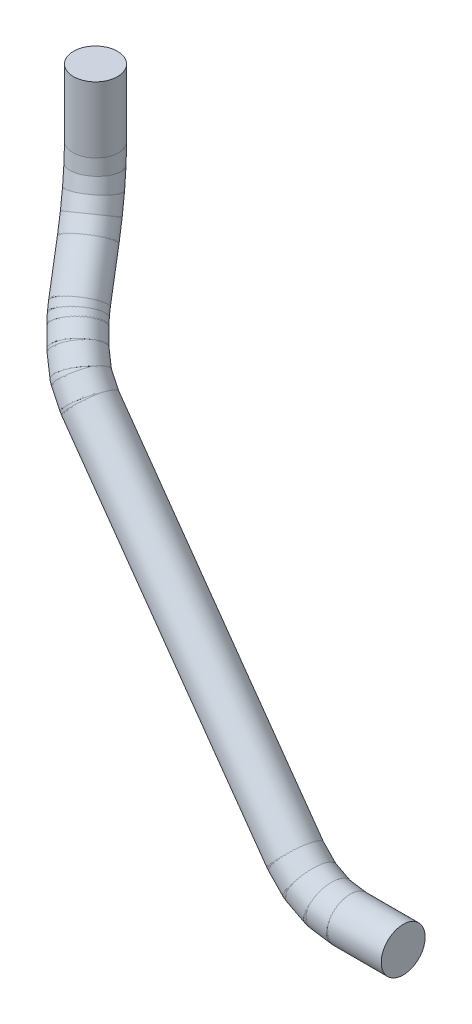
ISO-10303-21;
HEADER;
FILE_DESCRIPTION(('STEP AP214'),'2;1');
FILE_NAME('part.step','',(''),(''),'','','');
FILE_SCHEMA(('AUTOMOTIVE_DESIGN { 1 0 10303 214 1 1 1 1 }'));
ENDSEC;
DATA;
#1=APPLICATION_CONTEXT('core data for automotive mechanical design processes');
#2=APPLICATION_PROTOCOL_DEFINITION('international standard','automotive_design',2000,#1);
#3=PRODUCT_CONTEXT('',#1,'mechanical');
#4=PRODUCT('Part','Part','',(#3));
#5=PRODUCT_RELATED_PRODUCT_CATEGORY('part','',(#4));
#6=PRODUCT_DEFINITION_FORMATION('','',#4);
#7=PRODUCT_DEFINITION_CONTEXT('part definition',#1,'design');
#8=PRODUCT_DEFINITION('design','',#6,#7);
#9=PRODUCT_DEFINITION_SHAPE('','',#8);
#10=(LENGTH_UNIT() NAMED_UNIT(*) SI_UNIT(.MILLI.,.METRE.));
#11=(NAMED_UNIT(*) PLANE_ANGLE_UNIT() SI_UNIT($,.RADIAN.));
#12=(NAMED_UNIT(*) SI_UNIT($,.STERADIAN.) SOLID_ANGLE_UNIT());
#13=UNCERTAINTY_MEASURE_WITH_UNIT(LENGTH_MEASURE(1.E-05),#10,'distance_accuracy_value','');
#14=(GEOMETRIC_REPRESENTATION_CONTEXT(3) GLOBAL_UNCERTAINTY_ASSIGNED_CONTEXT((#13)) GLOBAL_UNIT_ASSIGNED_CONTEXT((#10,
#11,#12)) REPRESENTATION_CONTEXT('',''));
#15=CARTESIAN_POINT('',(0.,0.,0.));
#16=DIRECTION('',(0.,0.,1.));
#17=DIRECTION('',(1.,0.,0.));
#18=AXIS2_PLACEMENT_3D('',#15,#16,#17);
#19=CARTESIAN_POINT('',(-53.,-173.,205.));
#20=DIRECTION('',(-1.,0.,0.));
#21=DIRECTION('',(0.,0.,1.));
#22=AXIS2_PLACEMENT_3D('',#19,#20,#21);
#23=PLANE('',#22);
#24=CARTESIAN_POINT('',(-53.,-173.,205.));
#25=DIRECTION('',(-1.,0.,0.));
#26=DIRECTION('',(0.,0.,-1.));
#27=AXIS2_PLACEMENT_3D('',#24,#25,#26);
#28=CIRCLE('',#27,2.5);
#29=CARTESIAN_POINT('',(-53.,-173.,202.5));
#30=VERTEX_POINT('',#29);
#31=EDGE_CURVE('P0_E11',#30,#30,#28,.T.);
#32=ORIENTED_EDGE('',*,*,#31,.F.);
#33=EDGE_LOOP('',(#32));
#34=FACE_BOUND('',#33,.T.);
#35=ADVANCED_FACE('P0_F16',(#34),#23,.F.);
#36=CARTESIAN_POINT('',(-59.12983246279,-173.,205.));
#37=DIRECTION('',(-1.,0.,0.));
#38=DIRECTION('',(0.,0.,1.));
#39=AXIS2_PLACEMENT_3D('',#36,#37,#38);
#40=PLANE('',#39);
#41=CARTESIAN_POINT('',(-59.12983246279,-173.,205.));
#42=DIRECTION('',(-1.,0.,0.));
#43=DIRECTION('',(0.,0.,-1.));
#44=AXIS2_PLACEMENT_3D('',#41,#42,#43);
#45=CIRCLE('',#44,2.5);
#46=CARTESIAN_POINT('',(-59.12983246279,-173.,202.5));
#47=VERTEX_POINT('',#46);
#48=EDGE_CURVE('P0_E40',#47,#47,#45,.T.);
#49=ORIENTED_EDGE('',*,*,#48,.T.);
#50=EDGE_LOOP('',(#49));
#51=FACE_BOUND('',#50,.T.);
#52=ADVANCED_FACE('P0_F44',(#51),#40,.T.);
#53=CARTESIAN_POINT('',(-53.,-173.,205.));
#54=DIRECTION('',(-1.,0.,0.));
#55=DIRECTION('',(0.,0.,-1.));
#56=AXIS2_PLACEMENT_3D('',#53,#54,#55);
#57=CYLINDRICAL_SURFACE('',#56,2.5);
#58=ORIENTED_EDGE('',*,*,#48,.F.);
#59=DIRECTION('',(-1.,0.,0.));
#60=VECTOR('',#59,1.);
#61=CARTESIAN_POINT('',(-53.,-173.,202.5));
#62=LINE('',#61,#60);
#63=EDGE_CURVE('P0_E24',#30,#47,#62,.T.);
#64=ORIENTED_EDGE('',*,*,#63,.F.);
#65=ORIENTED_EDGE('',*,*,#31,.T.);
#66=ORIENTED_EDGE('',*,*,#63,.T.);
#67=EDGE_LOOP('',(#58,#64,#65,#66));
#68=FACE_BOUND('',#67,.T.);
#69=ADVANCED_FACE('P0_F39',(#68),#57,.T.);
#70=CLOSED_SHELL('',(#35,#52,#69));
#71=MANIFOLD_SOLID_BREP('P0_B1',#70);
#72=CARTESIAN_POINT('',(-59.12983246279,-173.,205.));
#73=DIRECTION('',(-0.99243422897261,0.119225702034953,-0.0293177955824285));
#74=DIRECTION('',(-0.0295284165390219,0.,0.999563941234725));
#75=AXIS2_PLACEMENT_3D('',#72,#73,#74);
#76=PLANE('',#75);
#77=CARTESIAN_POINT('',(-59.12983246279,-173.,205.));
#78=DIRECTION('',(-0.992434228972595,0.119225702035078,-0.0293177955824285));
#79=DIRECTION('',(-0.119276974311,-0.992861019176004,0.));
#80=AXIS2_PLACEMENT_3D('',#77,#78,#79);
#81=CIRCLE('',#80,2.5);
#82=CARTESIAN_POINT('',(-59.42802489857,-175.4821525479,205.));
#83=VERTEX_POINT('',#82);
#84=EDGE_CURVE('P1_E11',#83,#83,#81,.T.);
#85=ORIENTED_EDGE('',*,*,#84,.F.);
#86=EDGE_LOOP('',(#85));
#87=FACE_BOUND('',#86,.T.);
#88=ADVANCED_FACE('P1_F16',(#87),#76,.F.);
#89=CARTESIAN_POINT('',(-61.56680325523,-172.7072354569,204.92800871891));
#90=DIRECTION('',(-0.99243422897261,0.119225702034953,-0.0293177955824285));
#91=DIRECTION('',(-0.0295284165390219,0.,0.999563941234725));
#92=AXIS2_PLACEMENT_3D('',#89,#90,#91);
#93=PLANE('',#92);
#94=CARTESIAN_POINT('',(-61.56680325523,-172.7072354569,204.92800871891));
#95=DIRECTION('',(-0.992434228972595,0.119225702035078,-0.0293177955824285));
#96=DIRECTION('',(-0.119276974311,-0.992861019176004,0.));
#97=AXIS2_PLACEMENT_3D('',#94,#95,#96);
#98=CIRCLE('',#97,2.5);
#99=CARTESIAN_POINT('',(-61.86499569101,-175.1893880048,204.92800871891));
#100=VERTEX_POINT('',#99);
#101=EDGE_CURVE('P1_E40',#100,#100,#98,.T.);
#102=ORIENTED_EDGE('',*,*,#101,.T.);
#103=EDGE_LOOP('',(#102));
#104=FACE_BOUND('',#103,.T.);
#105=ADVANCED_FACE('P1_F43',(#104),#93,.T.);
#106=CARTESIAN_POINT('',(-59.12983246279,-173.,205.));
#107=DIRECTION('',(-0.992434228972595,0.119225702035078,-0.0293177955824285));
#108=DIRECTION('',(-0.119276974311,-0.992861019176004,0.));
#109=AXIS2_PLACEMENT_3D('',#106,#107,#108);
#110=CYLINDRICAL_SURFACE('',#109,2.5);
#111=ORIENTED_EDGE('',*,*,#101,.F.);
#112=DIRECTION('',(-0.99243422897261,0.119225702034953,-0.0293177955824285));
#113=VECTOR('',#112,1.);
#114=CARTESIAN_POINT('',(-59.42802489857,-175.4821525479,205.));
#115=LINE('',#114,#113);
#116=EDGE_CURVE('P1_E20',#83,#100,#115,.T.);
#117=ORIENTED_EDGE('',*,*,#116,.F.);
#118=ORIENTED_EDGE('',*,*,#84,.T.);
#119=ORIENTED_EDGE('',*,*,#116,.T.);
#120=EDGE_LOOP('',(#111,#117,#118,#119));
#121=FACE_BOUND('',#120,.T.);
#122=ADVANCED_FACE('P1_F18',(#121),#110,.T.);
#123=CLOSED_SHELL('',(#88,#105,#122));
#124=MANIFOLD_SOLID_BREP('P1_B1',#123);
#125=CARTESIAN_POINT('',(-61.56680325523,-172.7072354569,204.92800871891));
#126=DIRECTION('',(-0.932593219162136,0.350488129550051,-0.0861856056271026));
#127=DIRECTION('',(-0.0920228767758115,0.,0.995756893096856));
#128=AXIS2_PLACEMENT_3D('',#125,#126,#127);
#129=PLANE('',#128);
#130=CARTESIAN_POINT('',(-61.56680325523,-172.7072354569,204.92800871891));
#131=DIRECTION('',(-0.932593219162058,0.350488129550258,-0.0861856056271026));
#132=DIRECTION('',(-0.351797132155042,-0.936076267089113,0.));
#133=AXIS2_PLACEMENT_3D('',#130,#131,#132);
#134=CIRCLE('',#133,2.5);
#135=CARTESIAN_POINT('',(-62.44629608562,-175.0474261246,204.92800871891));
#136=VERTEX_POINT('',#135);
#137=EDGE_CURVE('P2_E11',#136,#136,#134,.T.);
#138=ORIENTED_EDGE('',*,*,#137,.F.);
#139=EDGE_LOOP('',(#138));
#140=FACE_BOUND('',#139,.T.);
#141=ADVANCED_FACE('P2_F16',(#140),#129,.F.);
#142=CARTESIAN_POINT('',(-63.85683152107,-171.8465947113,204.71637574868));
#143=DIRECTION('',(-0.932593219162136,0.350488129550051,-0.0861856056271026));
#144=DIRECTION('',(-0.0920228767758115,0.,0.995756893096856));
#145=AXIS2_PLACEMENT_3D('',#142,#143,#144);
#146=PLANE('',#145);
#147=CARTESIAN_POINT('',(-63.85683152107,-171.8465947113,204.71637574868));
#148=DIRECTION('',(-0.932593219162058,0.350488129550258,-0.0861856056271026));
#149=DIRECTION('',(-0.351797132155042,-0.936076267089113,0.));
#150=AXIS2_PLACEMENT_3D('',#147,#148,#149);
#151=CIRCLE('',#150,2.5);
#152=CARTESIAN_POINT('',(-64.73632435145,-174.186785379,204.71637574868));
#153=VERTEX_POINT('',#152);
#154=EDGE_CURVE('P2_E42',#153,#153,#151,.T.);
#155=ORIENTED_EDGE('',*,*,#154,.T.);
#156=EDGE_LOOP('',(#155));
#157=FACE_BOUND('',#156,.T.);
#158=ADVANCED_FACE('P2_F18',(#157),#146,.T.);
#159=CARTESIAN_POINT('',(-61.56680325523,-172.7072354569,204.92800871891));
#160=DIRECTION('',(-0.932593219162058,0.350488129550258,-0.0861856056271026));
#161=DIRECTION('',(-0.351797132155042,-0.936076267089113,0.));
#162=AXIS2_PLACEMENT_3D('',#159,#160,#161);
#163=CYLINDRICAL_SURFACE('',#162,2.5);
#164=ORIENTED_EDGE('',*,*,#154,.F.);
#165=DIRECTION('',(-0.932593219162136,0.350488129550051,-0.0861856056271026));
#166=VECTOR('',#165,1.);
#167=CARTESIAN_POINT('',(-62.44629608562,-175.0474261246,204.92800871891));
#168=LINE('',#167,#166);
#169=EDGE_CURVE('P2_E20',#136,#153,#168,.T.);
#170=ORIENTED_EDGE('',*,*,#169,.F.);
#171=ORIENTED_EDGE('',*,*,#137,.T.);
#172=ORIENTED_EDGE('',*,*,#169,.T.);
#173=EDGE_LOOP('',(#164,#170,#171,#172));
#174=FACE_BOUND('',#173,.T.);
#175=ADVANCED_FACE('P2_F41',(#174),#163,.T.);
#176=CLOSED_SHELL('',(#141,#158,#175));
#177=MANIFOLD_SOLID_BREP('P2_B1',#176);
#178=CARTESIAN_POINT('',(-63.85683152107,-171.8465947113,204.71637574868));
#179=DIRECTION('',(-0.816519445156086,0.560617102589059,-0.137856664571015));
#180=DIRECTION('',(-0.166478445273917,0.,0.986045093927849));
#181=AXIS2_PLACEMENT_3D('',#178,#179,#180);
#182=PLANE('',#181);
#183=CARTESIAN_POINT('',(-63.85683152107,-171.8465947113,204.71637574868));
#184=DIRECTION('',(-0.816519445156046,0.560617102589118,-0.137856664571014));
#185=DIRECTION('',(-0.566021367243065,-0.824390569951095,0.));
#186=AXIS2_PLACEMENT_3D('',#183,#184,#185);
#187=CIRCLE('',#186,2.5);
#188=CARTESIAN_POINT('',(-65.27188493917,-173.9075711361,204.71637574868));
#189=VERTEX_POINT('',#188);
#190=EDGE_CURVE('P3_E11',#189,#189,#187,.T.);
#191=ORIENTED_EDGE('',*,*,#190,.F.);
#192=EDGE_LOOP('',(#191));
#193=FACE_BOUND('',#192,.T.);
#194=ADVANCED_FACE('P3_F16',(#193),#182,.F.);
#195=CARTESIAN_POINT('',(-65.86183495728,-170.4699719942,204.3778619658));
#196=DIRECTION('',(-0.816519445156086,0.560617102589059,-0.137856664571015));
#197=DIRECTION('',(-0.166478445273917,0.,0.986045093927849));
#198=AXIS2_PLACEMENT_3D('',#195,#196,#197);
#199=PLANE('',#198);
#200=CARTESIAN_POINT('',(-65.86183495728,-170.4699719942,204.3778619658));
#201=DIRECTION('',(-0.816519445156046,0.560617102589118,-0.137856664571014));
#202=DIRECTION('',(-0.566021367243065,-0.824390569951095,0.));
#203=AXIS2_PLACEMENT_3D('',#200,#201,#202);
#204=CIRCLE('',#203,2.5);
#205=CARTESIAN_POINT('',(-67.27688837539,-172.5309484191,204.3778619658));
#206=VERTEX_POINT('',#205);
#207=EDGE_CURVE('P3_E42',#206,#206,#204,.T.);
#208=ORIENTED_EDGE('',*,*,#207,.T.);
#209=EDGE_LOOP('',(#208));
#210=FACE_BOUND('',#209,.T.);
#211=ADVANCED_FACE('P3_F18',(#210),#199,.T.);
#212=CARTESIAN_POINT('',(-63.85683152107,-171.8465947113,204.71637574868));
#213=DIRECTION('',(-0.816519445156046,0.560617102589118,-0.137856664571014));
#214=DIRECTION('',(-0.566021367243065,-0.824390569951095,0.));
#215=AXIS2_PLACEMENT_3D('',#212,#213,#214);
#216=CYLINDRICAL_SURFACE('',#215,2.5);
#217=ORIENTED_EDGE('',*,*,#207,.F.);
#218=DIRECTION('',(-0.816519445156086,0.560617102589059,-0.137856664571015));
#219=VECTOR('',#218,1.);
#220=CARTESIAN_POINT('',(-65.27188493917,-173.9075711361,204.71637574868));
#221=LINE('',#220,#219);
#222=EDGE_CURVE('P3_E20',#189,#206,#221,.T.);
#223=ORIENTED_EDGE('',*,*,#222,.F.);
#224=ORIENTED_EDGE('',*,*,#190,.T.);
#225=ORIENTED_EDGE('',*,*,#222,.T.);
#226=EDGE_LOOP('',(#217,#223,#224,#225));
#227=FACE_BOUND('',#226,.T.);
#228=ADVANCED_FACE('P3_F41',(#227),#216,.T.);
#229=CLOSED_SHELL('',(#194,#211,#228));
#230=MANIFOLD_SOLID_BREP('P3_B1',#229);
#231=CARTESIAN_POINT('',(-65.86183495728,-170.4699719942,204.3778619658));
#232=DIRECTION('',(-0.739460224853974,0.653725706030977,-0.160752222793995));
#233=DIRECTION('',(-0.212429644330605,0.,0.977176363922896));
#234=AXIS2_PLACEMENT_3D('',#231,#232,#233);
#235=PLANE('',#234);
#236=CARTESIAN_POINT('',(-65.86183495728,-170.4699719942,204.3778619658));
#237=DIRECTION('',(-0.739460224854298,0.653725706030611,-0.160752222793995));
#238=DIRECTION('',(-0.66233956873723,-0.74920377447326,0.));
#239=AXIS2_PLACEMENT_3D('',#236,#237,#238);
#240=CIRCLE('',#239,2.5);
#241=CARTESIAN_POINT('',(-67.51768387912,-172.3429814304,204.3778619658));
#242=VERTEX_POINT('',#241);
#243=EDGE_CURVE('P4_E11',#242,#242,#240,.T.);
#244=ORIENTED_EDGE('',*,*,#243,.F.);
#245=EDGE_LOOP('',(#244));
#246=FACE_BOUND('',#245,.T.);
#247=ADVANCED_FACE('P4_F16',(#246),#235,.F.);
#248=CARTESIAN_POINT('',(-95.77841228164,-144.0219833452,197.87425819964));
#249=DIRECTION('',(-0.739460224853974,0.653725706030977,-0.160752222793995));
#250=DIRECTION('',(-0.212429644330605,0.,0.977176363922896));
#251=AXIS2_PLACEMENT_3D('',#248,#249,#250);
#252=PLANE('',#251);
#253=CARTESIAN_POINT('',(-95.77841228164,-144.0219833452,197.87425819964));
#254=DIRECTION('',(-0.739460224854298,0.653725706030611,-0.160752222793995));
#255=DIRECTION('',(-0.66233956873723,-0.74920377447326,0.));
#256=AXIS2_PLACEMENT_3D('',#253,#254,#255);
#257=CIRCLE('',#256,2.5);
#258=CARTESIAN_POINT('',(-97.43426120348,-145.8949927813,197.87425819964));
#259=VERTEX_POINT('',#258);
#260=EDGE_CURVE('P4_E40',#259,#259,#257,.T.);
#261=ORIENTED_EDGE('',*,*,#260,.T.);
#262=EDGE_LOOP('',(#261));
#263=FACE_BOUND('',#262,.T.);
#264=ADVANCED_FACE('P4_F44',(#263),#252,.T.);
#265=CARTESIAN_POINT('',(-65.86183495728,-170.4699719942,204.3778619658));
#266=DIRECTION('',(-0.739460224854298,0.653725706030611,-0.160752222793995));
#267=DIRECTION('',(-0.66233956873723,-0.74920377447326,0.));
#268=AXIS2_PLACEMENT_3D('',#265,#266,#267);
#269=CYLINDRICAL_SURFACE('',#268,2.5);
#270=ORIENTED_EDGE('',*,*,#260,.F.);
#271=DIRECTION('',(-0.739460224853974,0.653725706030977,-0.160752222793995));
#272=VECTOR('',#271,1.);
#273=CARTESIAN_POINT('',(-67.51768387912,-172.3429814304,204.3778619658));
#274=LINE('',#273,#272);
#275=EDGE_CURVE('P4_E25',#242,#259,#274,.T.);
#276=ORIENTED_EDGE('',*,*,#275,.F.);
#277=ORIENTED_EDGE('',*,*,#243,.T.);
#278=ORIENTED_EDGE('',*,*,#275,.T.);
#279=EDGE_LOOP('',(#270,#276,#277,#278));
#280=FACE_BOUND('',#279,.T.);
#281=ADVANCED_FACE('P4_F18',(#280),#269,.T.);
#282=CLOSED_SHELL('',(#247,#264,#281));
#283=MANIFOLD_SOLID_BREP('P4_B1',#282);
#284=CARTESIAN_POINT('',(-95.77841228164,-144.0219833452,197.87425819964));
#285=DIRECTION('',(-0.71239122060874,0.647090480775764,-0.271611226735901));
#286=DIRECTION('',(-0.356251992436246,0.,0.934389917478354));
#287=AXIS2_PLACEMENT_3D('',#284,#285,#286);
#288=PLANE('',#287);
#289=CARTESIAN_POINT('',(-95.77841228164,-144.0219833452,197.87425819964));
#290=DIRECTION('',(-0.71239122060866,0.647090480775852,-0.271611226735901));
#291=DIRECTION('',(-0.672366725406209,-0.74021820199623,0.));
#292=AXIS2_PLACEMENT_3D('',#289,#290,#291);
#293=CIRCLE('',#292,2.5);
#294=CARTESIAN_POINT('',(-97.45932909515,-145.8725288502,197.87425819964));
#295=VERTEX_POINT('',#294);
#296=EDGE_CURVE('P5_E11',#295,#295,#293,.T.);
#297=ORIENTED_EDGE('',*,*,#296,.F.);
#298=EDGE_LOOP('',(#297));
#299=FACE_BOUND('',#298,.T.);
#300=ADVANCED_FACE('P5_F16',(#299),#288,.F.);
#301=CARTESIAN_POINT('',(-97.40440011946,-142.5450403098,197.2543227786));
#302=DIRECTION('',(-0.71239122060874,0.647090480775764,-0.271611226735901));
#303=DIRECTION('',(-0.356251992436246,0.,0.934389917478354));
#304=AXIS2_PLACEMENT_3D('',#301,#302,#303);
#305=PLANE('',#304);
#306=CARTESIAN_POINT('',(-97.40440011946,-142.5450403098,197.2543227786));
#307=DIRECTION('',(-0.71239122060866,0.647090480775852,-0.271611226735901));
#308=DIRECTION('',(-0.672366725406209,-0.74021820199623,0.));
#309=AXIS2_PLACEMENT_3D('',#306,#307,#308);
#310=CIRCLE('',#309,2.5);
#311=CARTESIAN_POINT('',(-99.08531693297,-144.3955858148,197.2543227786));
#312=VERTEX_POINT('',#311);
#313=EDGE_CURVE('P5_E41',#312,#312,#310,.T.);
#314=ORIENTED_EDGE('',*,*,#313,.T.);
#315=EDGE_LOOP('',(#314));
#316=FACE_BOUND('',#315,.T.);
#317=ADVANCED_FACE('P5_F18',(#316),#305,.T.);
#318=CARTESIAN_POINT('',(-95.77841228164,-144.0219833452,197.87425819964));
#319=DIRECTION('',(-0.71239122060866,0.647090480775852,-0.271611226735901));
#320=DIRECTION('',(-0.672366725406209,-0.74021820199623,0.));
#321=AXIS2_PLACEMENT_3D('',#318,#319,#320);
#322=CYLINDRICAL_SURFACE('',#321,2.5);
#323=ORIENTED_EDGE('',*,*,#313,.F.);
#324=DIRECTION('',(-0.71239122060874,0.647090480775764,-0.271611226735901));
#325=VECTOR('',#324,1.);
#326=CARTESIAN_POINT('',(-97.45932909515,-145.8725288502,197.87425819964));
#327=LINE('',#326,#325);
#328=EDGE_CURVE('P5_E25',#295,#312,#327,.T.);
#329=ORIENTED_EDGE('',*,*,#328,.F.);
#330=ORIENTED_EDGE('',*,*,#296,.T.);
#331=ORIENTED_EDGE('',*,*,#328,.T.);
#332=EDGE_LOOP('',(#323,#329,#330,#331));
#333=FACE_BOUND('',#332,.T.);
#334=ADVANCED_FACE('P5_F40',(#333),#322,.T.);
#335=CLOSED_SHELL('',(#300,#317,#334));
#336=MANIFOLD_SOLID_BREP('P5_B1',#335);
#337=CARTESIAN_POINT('',(-97.40440011946,-142.5450403098,197.2543227786));
#338=DIRECTION('',(-0.630803208879181,0.608651632210175,-0.481280066360138));
#339=DIRECTION('',(-0.606575841051905,0.,0.795025627921625));
#340=AXIS2_PLACEMENT_3D('',#337,#338,#339);
#341=PLANE('',#340);
#342=CARTESIAN_POINT('',(-97.40440011946,-142.5450403098,197.2543227786));
#343=DIRECTION('',(-0.630803208879269,0.608651632210083,-0.481280066360138));
#344=DIRECTION('',(-0.694358462614712,-0.719629297204702,0.));
#345=AXIS2_PLACEMENT_3D('',#342,#343,#344);
#346=CIRCLE('',#345,2.5);
#347=CARTESIAN_POINT('',(-99.14029627599,-144.3441135528,197.2543227786));
#348=VERTEX_POINT('',#347);
#349=EDGE_CURVE('P6_E11',#348,#348,#346,.T.);
#350=ORIENTED_EDGE('',*,*,#349,.F.);
#351=EDGE_LOOP('',(#350));
#352=FACE_BOUND('',#351,.T.);
#353=ADVANCED_FACE('P6_F16',(#352),#341,.F.);
#354=CARTESIAN_POINT('',(-98.84416848833,-141.1558315116,196.15583151166));
#355=DIRECTION('',(-0.630803208879181,0.608651632210175,-0.481280066360138));
#356=DIRECTION('',(-0.606575841051905,0.,0.795025627921625));
#357=AXIS2_PLACEMENT_3D('',#354,#355,#356);
#358=PLANE('',#357);
#359=CARTESIAN_POINT('',(-98.84416848833,-141.1558315116,196.15583151166));
#360=DIRECTION('',(-0.630803208879269,0.608651632210083,-0.481280066360138));
#361=DIRECTION('',(-0.694358462614712,-0.719629297204702,0.));
#362=AXIS2_PLACEMENT_3D('',#359,#360,#361);
#363=CIRCLE('',#362,2.5);
#364=CARTESIAN_POINT('',(-100.5800646448,-142.9549047546,196.15583151166));
#365=VERTEX_POINT('',#364);
#366=EDGE_CURVE('P6_E20',#365,#365,#363,.T.);
#367=ORIENTED_EDGE('',*,*,#366,.T.);
#368=EDGE_LOOP('',(#367));
#369=FACE_BOUND('',#368,.T.);
#370=ADVANCED_FACE('P6_F44',(#369),#358,.T.);
#371=CARTESIAN_POINT('',(-97.40440011946,-142.5450403098,197.2543227786));
#372=DIRECTION('',(-0.630803208879269,0.608651632210083,-0.481280066360138));
#373=DIRECTION('',(-0.694358462614712,-0.719629297204702,0.));
#374=AXIS2_PLACEMENT_3D('',#371,#372,#373);
#375=CYLINDRICAL_SURFACE('',#374,2.5);
#376=ORIENTED_EDGE('',*,*,#366,.F.);
#377=DIRECTION('',(-0.630803208879181,0.608651632210175,-0.481280066360138));
#378=VECTOR('',#377,1.);
#379=CARTESIAN_POINT('',(-99.14029627599,-144.3441135528,197.2543227786));
#380=LINE('',#379,#378);
#381=EDGE_CURVE('P6_E26',#348,#365,#380,.T.);
#382=ORIENTED_EDGE('',*,*,#381,.F.);
#383=ORIENTED_EDGE('',*,*,#349,.T.);
#384=ORIENTED_EDGE('',*,*,#381,.T.);
#385=EDGE_LOOP('',(#376,#382,#383,#384));
#386=FACE_BOUND('',#385,.T.);
#387=ADVANCED_FACE('P6_F18',(#386),#375,.T.);
#388=CLOSED_SHELL('',(#353,#370,#387));
#389=MANIFOLD_SOLID_BREP('P6_B1',#388);
#390=CARTESIAN_POINT('',(-98.84416848833,-141.1558315116,196.15583151166));
#391=DIRECTION('',(-0.577350269189626,0.577350269189626,-0.577350269189626));
#392=DIRECTION('',(-0.707106781186548,0.,0.707106781186548));
#393=AXIS2_PLACEMENT_3D('',#390,#391,#392);
#394=PLANE('',#393);
#395=CARTESIAN_POINT('',(-98.84416848833,-141.1558315116,196.15583151166));
#396=DIRECTION('',(-0.577350269189626,0.577350269189626,-0.577350269189626));
#397=DIRECTION('',(0.,-0.707106781186548,-0.707106781186548));
#398=AXIS2_PLACEMENT_3D('',#395,#396,#397);
#399=CIRCLE('',#398,2.5);
#400=CARTESIAN_POINT('',(-98.84416848833,-142.9235984646,194.38806455869));
#401=VERTEX_POINT('',#400);
#402=EDGE_CURVE('P7_E11',#401,#401,#399,.T.);
#403=ORIENTED_EDGE('',*,*,#402,.F.);
#404=EDGE_LOOP('',(#403));
#405=FACE_BOUND('',#404,.T.);
#406=ADVANCED_FACE('P7_F16',(#405),#394,.F.);
#407=CARTESIAN_POINT('',(-99.96036526784,-140.0396347321,195.03963473215));
#408=DIRECTION('',(-0.577350269189626,0.577350269189626,-0.577350269189626));
#409=DIRECTION('',(-0.707106781186548,0.,0.707106781186548));
#410=AXIS2_PLACEMENT_3D('',#407,#408,#409);
#411=PLANE('',#410);
#412=CARTESIAN_POINT('',(-99.96036526784,-140.0396347321,195.03963473215));
#413=DIRECTION('',(-0.577350269189626,0.577350269189626,-0.577350269189626));
#414=DIRECTION('',(0.,-0.707106781186548,-0.707106781186548));
#415=AXIS2_PLACEMENT_3D('',#412,#413,#414);
#416=CIRCLE('',#415,2.5);
#417=CARTESIAN_POINT('',(-99.96036526784,-141.8074016851,193.27186777918));
#418=VERTEX_POINT('',#417);
#419=EDGE_CURVE('P7_E40',#418,#418,#416,.T.);
#420=ORIENTED_EDGE('',*,*,#419,.T.);
#421=EDGE_LOOP('',(#420));
#422=FACE_BOUND('',#421,.T.);
#423=ADVANCED_FACE('P7_F43',(#422),#411,.T.);
#424=CARTESIAN_POINT('',(-98.84416848833,-141.1558315116,196.15583151166));
#425=DIRECTION('',(-0.577350269189626,0.577350269189626,-0.577350269189626));
#426=DIRECTION('',(0.,-0.707106781186548,-0.707106781186548));
#427=AXIS2_PLACEMENT_3D('',#424,#425,#426);
#428=CYLINDRICAL_SURFACE('',#427,2.5);
#429=ORIENTED_EDGE('',*,*,#419,.F.);
#430=DIRECTION('',(-0.577350269189626,0.577350269189626,-0.577350269189626));
#431=VECTOR('',#430,1.);
#432=CARTESIAN_POINT('',(-98.84416848833,-142.9235984646,194.38806455869));
#433=LINE('',#432,#431);
#434=EDGE_CURVE('P7_E20',#401,#418,#433,.T.);
#435=ORIENTED_EDGE('',*,*,#434,.F.);
#436=ORIENTED_EDGE('',*,*,#402,.T.);
#437=ORIENTED_EDGE('',*,*,#434,.T.);
#438=EDGE_LOOP('',(#429,#435,#436,#437));
#439=FACE_BOUND('',#438,.T.);
#440=ADVANCED_FACE('P7_F18',(#439),#428,.T.);
#441=CLOSED_SHELL('',(#406,#423,#440));
#442=MANIFOLD_SOLID_BREP('P7_B1',#441);
#443=CARTESIAN_POINT('',(-99.96036526784,-140.0396347321,195.03963473215));
#444=DIRECTION('',(-0.539895562832098,0.60336507513611,-0.586910016391107));
#445=DIRECTION('',(-0.735969531722545,0.,0.677014658907839));
#446=AXIS2_PLACEMENT_3D('',#443,#444,#445);
#447=PLANE('',#446);
#448=CARTESIAN_POINT('',(-99.96036526784,-140.0396347321,195.03963473215));
#449=DIRECTION('',(-0.539895562832098,0.603365075136703,-0.586910016390496));
#450=DIRECTION('',(0.,0.697264696509956,0.716813743590955));
#451=AXIS2_PLACEMENT_3D('',#448,#449,#450);
#452=CIRCLE('',#451,2.5);
#453=CARTESIAN_POINT('',(-99.96036526784,-138.2964729908,196.83166909112));
#454=VERTEX_POINT('',#453);
#455=EDGE_CURVE('P8_E11',#454,#454,#452,.T.);
#456=ORIENTED_EDGE('',*,*,#455,.F.);
#457=EDGE_LOOP('',(#456));
#458=FACE_BOUND('',#457,.T.);
#459=ADVANCED_FACE('P8_F16',(#458),#447,.F.);
#460=CARTESIAN_POINT('',(-100.4633481079,-139.4775217977,194.49285182216));
#461=DIRECTION('',(-0.539895562832098,0.60336507513611,-0.586910016391107));
#462=DIRECTION('',(-0.735969531722545,0.,0.677014658907839));
#463=AXIS2_PLACEMENT_3D('',#460,#461,#462);
#464=PLANE('',#463);
#465=CARTESIAN_POINT('',(-100.4633481079,-139.4775217977,194.49285182216));
#466=DIRECTION('',(-0.539895562832098,0.603365075136703,-0.586910016390496));
#467=DIRECTION('',(0.,0.697264696509956,0.716813743590955));
#468=AXIS2_PLACEMENT_3D('',#465,#466,#467);
#469=CIRCLE('',#468,2.5);
#470=CARTESIAN_POINT('',(-100.4633481079,-137.7343600564,196.28488618114));
#471=VERTEX_POINT('',#470);
#472=EDGE_CURVE('P8_E41',#471,#471,#469,.T.);
#473=ORIENTED_EDGE('',*,*,#472,.T.);
#474=EDGE_LOOP('',(#473));
#475=FACE_BOUND('',#474,.T.);
#476=ADVANCED_FACE('P8_F18',(#475),#464,.T.);
#477=CARTESIAN_POINT('',(-99.96036526784,-140.0396347321,195.03963473215));
#478=DIRECTION('',(-0.539895562832098,0.603365075136703,-0.586910016390496));
#479=DIRECTION('',(0.,0.697264696509956,0.716813743590955));
#480=AXIS2_PLACEMENT_3D('',#477,#478,#479);
#481=CYLINDRICAL_SURFACE('',#480,2.5);
#482=ORIENTED_EDGE('',*,*,#472,.F.);
#483=DIRECTION('',(-0.539895562832098,0.60336507513611,-0.586910016391107));
#484=VECTOR('',#483,1.);
#485=CARTESIAN_POINT('',(-99.96036526784,-138.2964729908,196.83166909112));
#486=LINE('',#485,#484);
#487=EDGE_CURVE('P8_E25',#454,#471,#486,.T.);
#488=ORIENTED_EDGE('',*,*,#487,.F.);
#489=ORIENTED_EDGE('',*,*,#455,.T.);
#490=ORIENTED_EDGE('',*,*,#487,.T.);
#491=EDGE_LOOP('',(#482,#488,#489,#490));
#492=FACE_BOUND('',#491,.T.);
#493=ADVANCED_FACE('P8_F40',(#492),#481,.T.);
#494=CLOSED_SHELL('',(#459,#476,#493));
#495=MANIFOLD_SOLID_BREP('P8_B1',#494);
#496=CARTESIAN_POINT('',(-100.4633481079,-139.4775217977,194.49285182216));
#497=DIRECTION('',(-0.46155364714499,0.651411310427986,-0.602188953280987));
#498=DIRECTION('',(-0.793685618854403,0.,0.608328150280508));
#499=AXIS2_PLACEMENT_3D('',#496,#497,#498);
#500=PLANE('',#499);
#501=CARTESIAN_POINT('',(-100.4633481079,-139.4775217977,194.49285182216));
#502=DIRECTION('',(-0.46155364714499,0.65141131042807,-0.602188953280897));
#503=DIRECTION('',(0.,0.678819303990802,0.734305353738786));
#504=AXIS2_PLACEMENT_3D('',#501,#502,#503);
#505=CIRCLE('',#504,2.5);
#506=CARTESIAN_POINT('',(-100.4633481079,-137.7804735377,196.32861520651));
#507=VERTEX_POINT('',#506);
#508=EDGE_CURVE('P9_E11',#507,#507,#505,.T.);
#509=ORIENTED_EDGE('',*,*,#508,.F.);
#510=EDGE_LOOP('',(#509));
#511=FACE_BOUND('',#510,.T.);
#512=ADVANCED_FACE('P9_F16',(#511),#500,.F.);
#513=CARTESIAN_POINT('',(-100.8933452783,-138.8706475546,193.93183459798));
#514=DIRECTION('',(-0.46155364714499,0.651411310427986,-0.602188953280987));
#515=DIRECTION('',(-0.793685618854403,0.,0.608328150280508));
#516=AXIS2_PLACEMENT_3D('',#513,#514,#515);
#517=PLANE('',#516);
#518=CARTESIAN_POINT('',(-100.8933452783,-138.8706475546,193.93183459798));
#519=DIRECTION('',(-0.46155364714499,0.65141131042807,-0.602188953280897));
#520=DIRECTION('',(0.,0.678819303990802,0.734305353738786));
#521=AXIS2_PLACEMENT_3D('',#518,#519,#520);
#522=CIRCLE('',#521,2.5);
#523=CARTESIAN_POINT('',(-100.8933452783,-137.1735992947,195.76759798233));
#524=VERTEX_POINT('',#523);
#525=EDGE_CURVE('P9_E40',#524,#524,#522,.T.);
#526=ORIENTED_EDGE('',*,*,#525,.T.);
#527=EDGE_LOOP('',(#526));
#528=FACE_BOUND('',#527,.T.);
#529=ADVANCED_FACE('P9_F43',(#528),#517,.T.);
#530=CARTESIAN_POINT('',(-100.4633481079,-139.4775217977,194.49285182216));
#531=DIRECTION('',(-0.46155364714499,0.65141131042807,-0.602188953280897));
#532=DIRECTION('',(0.,0.678819303990802,0.734305353738786));
#533=AXIS2_PLACEMENT_3D('',#530,#531,#532);
#534=CYLINDRICAL_SURFACE('',#533,2.5);
#535=ORIENTED_EDGE('',*,*,#525,.F.);
#536=DIRECTION('',(-0.46155364714499,0.651411310427987,-0.602188953280987));
#537=VECTOR('',#536,1.);
#538=CARTESIAN_POINT('',(-100.4633481079,-137.7804735377,196.32861520651));
#539=LINE('',#538,#537);
#540=EDGE_CURVE('P9_E19',#507,#524,#539,.T.);
#541=ORIENTED_EDGE('',*,*,#540,.F.);
#542=ORIENTED_EDGE('',*,*,#508,.T.);
#543=ORIENTED_EDGE('',*,*,#540,.T.);
#544=EDGE_LOOP('',(#535,#541,#542,#543));
#545=FACE_BOUND('',#544,.T.);
#546=ADVANCED_FACE('P9_F39',(#545),#534,.T.);
#547=CLOSED_SHELL('',(#512,#529,#546));
#548=MANIFOLD_SOLID_BREP('P9_B1',#547);
#549=CARTESIAN_POINT('',(-100.8933452783,-138.8706475546,193.93183459798));
#550=DIRECTION('',(-0.420836519204844,0.673338430727751,-0.607874972184775));
#551=DIRECTION('',(-0.822192191643779,0.,0.569209978830308));
#552=AXIS2_PLACEMENT_3D('',#549,#550,#551);
#553=PLANE('',#552);
#554=CARTESIAN_POINT('',(-100.8933452783,-138.8706475546,193.93183459798));
#555=DIRECTION('',(-0.420836519204844,0.673338430727481,-0.607874972185074));
#556=DIRECTION('',(0.,0.670103092783834,0.742268041236816));
#557=AXIS2_PLACEMENT_3D('',#554,#555,#556);
#558=CIRCLE('',#557,2.5);
#559=CARTESIAN_POINT('',(-100.8933452783,-137.1953898227,195.78750470107));
#560=VERTEX_POINT('',#559);
#561=EDGE_CURVE('P10_E11',#560,#560,#558,.T.);
#562=ORIENTED_EDGE('',*,*,#561,.F.);
#563=EDGE_LOOP('',(#562));
#564=FACE_BOUND('',#563,.T.);
#565=ADVANCED_FACE('P10_F16',(#564),#553,.F.);
#566=CARTESIAN_POINT('',(-103.1406097506,-135.2750243988,190.68578591565));
#567=DIRECTION('',(-0.420836519204844,0.673338430727751,-0.607874972184775));
#568=DIRECTION('',(-0.822192191643779,0.,0.569209978830308));
#569=AXIS2_PLACEMENT_3D('',#566,#567,#568);
#570=PLANE('',#569);
#571=CARTESIAN_POINT('',(-103.1406097506,-135.2750243988,190.68578591565));
#572=DIRECTION('',(-0.420836519204844,0.673338430727481,-0.607874972185074));
#573=DIRECTION('',(0.,0.670103092783834,0.742268041236816));
#574=AXIS2_PLACEMENT_3D('',#571,#572,#573);
#575=CIRCLE('',#574,2.5);
#576=CARTESIAN_POINT('',(-103.1406097506,-133.5997666669,192.54145601875));
#577=VERTEX_POINT('',#576);
#578=EDGE_CURVE('P10_E41',#577,#577,#575,.T.);
#579=ORIENTED_EDGE('',*,*,#578,.T.);
#580=EDGE_LOOP('',(#579));
#581=FACE_BOUND('',#580,.T.);
#582=ADVANCED_FACE('P10_F18',(#581),#570,.T.);
#583=CARTESIAN_POINT('',(-100.8933452783,-138.8706475546,193.93183459798));
#584=DIRECTION('',(-0.420836519204844,0.673338430727481,-0.607874972185074));
#585=DIRECTION('',(0.,0.670103092783834,0.742268041236816));
#586=AXIS2_PLACEMENT_3D('',#583,#584,#585);
#587=CYLINDRICAL_SURFACE('',#586,2.5);
#588=ORIENTED_EDGE('',*,*,#578,.F.);
#589=DIRECTION('',(-0.420836519204844,0.673338430727751,-0.607874972184775));
#590=VECTOR('',#589,1.);
#591=CARTESIAN_POINT('',(-100.8933452783,-137.1953898227,195.78750470107));
#592=LINE('',#591,#590);
#593=EDGE_CURVE('P10_E25',#560,#577,#592,.T.);
#594=ORIENTED_EDGE('',*,*,#593,.F.);
#595=ORIENTED_EDGE('',*,*,#561,.T.);
#596=ORIENTED_EDGE('',*,*,#593,.T.);
#597=EDGE_LOOP('',(#588,#594,#595,#596));
#598=FACE_BOUND('',#597,.T.);
#599=ADVANCED_FACE('P10_F40',(#598),#587,.T.);
#600=CLOSED_SHELL('',(#565,#582,#599));
#601=MANIFOLD_SOLID_BREP('P10_B1',#600);
#602=CARTESIAN_POINT('',(-103.1406097506,-135.2750243988,190.68578591565));
#603=DIRECTION('',(-0.378770003641015,0.746459305577029,-0.547112227481021));
#604=DIRECTION('',(-0.822192191643562,0.,0.569209978830621));
#605=AXIS2_PLACEMENT_3D('',#602,#603,#604);
#606=PLANE('',#605);
#607=CARTESIAN_POINT('',(-103.1406097506,-135.2750243988,190.68578591565));
#608=DIRECTION('',(-0.378770003641015,0.746459305577094,-0.547112227480933));
#609=DIRECTION('',(0.,0.591158990682834,0.806555049413773));
#610=AXIS2_PLACEMENT_3D('',#607,#608,#609);
#611=CIRCLE('',#610,2.5);
#612=CARTESIAN_POINT('',(-103.1406097506,-133.7971269221,192.70217353919));
#613=VERTEX_POINT('',#612);
#614=EDGE_CURVE('P11_E11',#613,#613,#611,.T.);
#615=ORIENTED_EDGE('',*,*,#614,.F.);
#616=EDGE_LOOP('',(#615));
#617=FACE_BOUND('',#616,.T.);
#618=ADVANCED_FACE('P11_F16',(#617),#606,.F.);
#619=CARTESIAN_POINT('',(-103.9271084948,-133.7250354854,189.54973217413));
#620=DIRECTION('',(-0.378770003641015,0.746459305577029,-0.547112227481021));
#621=DIRECTION('',(-0.822192191643562,0.,0.569209978830621));
#622=AXIS2_PLACEMENT_3D('',#619,#620,#621);
#623=PLANE('',#622);
#624=CARTESIAN_POINT('',(-103.9271084948,-133.7250354854,189.54973217413));
#625=DIRECTION('',(-0.378770003641015,0.746459305577094,-0.547112227480933));
#626=DIRECTION('',(0.,0.591158990682834,0.806555049413773));
#627=AXIS2_PLACEMENT_3D('',#624,#625,#626);
#628=CIRCLE('',#627,2.5);
#629=CARTESIAN_POINT('',(-103.9271084948,-132.2471380087,191.56611979766));
#630=VERTEX_POINT('',#629);
#631=EDGE_CURVE('P11_E41',#630,#630,#628,.T.);
#632=ORIENTED_EDGE('',*,*,#631,.T.);
#633=EDGE_LOOP('',(#632));
#634=FACE_BOUND('',#633,.T.);
#635=ADVANCED_FACE('P11_F18',(#634),#623,.T.);
#636=CARTESIAN_POINT('',(-103.1406097506,-135.2750243988,190.68578591565));
#637=DIRECTION('',(-0.378770003641015,0.746459305577094,-0.547112227480933));
#638=DIRECTION('',(0.,0.591158990682834,0.806555049413773));
#639=AXIS2_PLACEMENT_3D('',#636,#637,#638);
#640=CYLINDRICAL_SURFACE('',#639,2.5);
#641=ORIENTED_EDGE('',*,*,#631,.F.);
#642=DIRECTION('',(-0.378770003641015,0.746459305577029,-0.547112227481021));
#643=VECTOR('',#642,1.);
#644=CARTESIAN_POINT('',(-103.1406097506,-133.7971269221,192.70217353919));
#645=LINE('',#644,#643);
#646=EDGE_CURVE('P11_E25',#613,#630,#645,.T.);
#647=ORIENTED_EDGE('',*,*,#646,.F.);
#648=ORIENTED_EDGE('',*,*,#614,.T.);
#649=ORIENTED_EDGE('',*,*,#646,.T.);
#650=EDGE_LOOP('',(#641,#647,#648,#649));
#651=FACE_BOUND('',#650,.T.);
#652=ADVANCED_FACE('P11_F40',(#651),#640,.T.);
#653=CLOSED_SHELL('',(#618,#635,#652));
#654=MANIFOLD_SOLID_BREP('P11_B1',#653);
#655=CARTESIAN_POINT('',(-103.9271084948,-133.7250354854,189.54973217413));
#656=DIRECTION('',(-0.282854237379882,0.867793925721636,-0.408567231770828));
#657=DIRECTION('',(-0.822192191643706,0.,0.569209978830413));
#658=AXIS2_PLACEMENT_3D('',#655,#656,#657);
#659=PLANE('',#658);
#660=CARTESIAN_POINT('',(-103.9271084948,-133.7250354854,189.54973217413));
#661=DIRECTION('',(-0.282854237379882,0.867793925721641,-0.408567231770818));
#662=DIRECTION('',(0.,0.425962293977137,0.904740915461291));
#663=AXIS2_PLACEMENT_3D('',#660,#661,#662);
#664=CIRCLE('',#663,2.5);
#665=CARTESIAN_POINT('',(-103.9271084948,-132.6601297505,191.81158446278));
#666=VERTEX_POINT('',#665);
#667=EDGE_CURVE('P12_E11',#666,#666,#664,.T.);
#668=ORIENTED_EDGE('',*,*,#667,.F.);
#669=EDGE_LOOP('',(#668));
#670=FACE_BOUND('',#669,.T.);
#671=ADVANCED_FACE('P12_F16',(#670),#659,.F.);
#672=CARTESIAN_POINT('',(-104.5144424978,-131.923100733,188.70136083639));
#673=DIRECTION('',(-0.282854237379882,0.867793925721636,-0.408567231770828));
#674=DIRECTION('',(-0.822192191643706,0.,0.569209978830413));
#675=AXIS2_PLACEMENT_3D('',#672,#673,#674);
#676=PLANE('',#675);
#677=CARTESIAN_POINT('',(-104.5144424978,-131.923100733,188.70136083639));
#678=DIRECTION('',(-0.282854237379882,0.867793925721641,-0.408567231770818));
#679=DIRECTION('',(0.,0.425962293977137,0.904740915461291));
#680=AXIS2_PLACEMENT_3D('',#677,#678,#679);
#681=CIRCLE('',#680,2.5);
#682=CARTESIAN_POINT('',(-104.5144424978,-130.858194998,190.96321312505));
#683=VERTEX_POINT('',#682);
#684=EDGE_CURVE('P12_E40',#683,#683,#681,.T.);
#685=ORIENTED_EDGE('',*,*,#684,.T.);
#686=EDGE_LOOP('',(#685));
#687=FACE_BOUND('',#686,.T.);
#688=ADVANCED_FACE('P12_F44',(#687),#676,.T.);
#689=CARTESIAN_POINT('',(-103.9271084948,-133.7250354854,189.54973217413));
#690=DIRECTION('',(-0.282854237379882,0.867793925721641,-0.408567231770818));
#691=DIRECTION('',(0.,0.425962293977137,0.904740915461291));
#692=AXIS2_PLACEMENT_3D('',#689,#690,#691);
#693=CYLINDRICAL_SURFACE('',#692,2.5);
#694=ORIENTED_EDGE('',*,*,#684,.F.);
#695=DIRECTION('',(-0.282854237379882,0.867793925721636,-0.408567231770828));
#696=VECTOR('',#695,1.);
#697=CARTESIAN_POINT('',(-103.9271084948,-132.6601297505,191.81158446278));
#698=LINE('',#697,#696);
#699=EDGE_CURVE('P12_E25',#666,#683,#698,.T.);
#700=ORIENTED_EDGE('',*,*,#699,.F.);
#701=ORIENTED_EDGE('',*,*,#667,.T.);
#702=ORIENTED_EDGE('',*,*,#699,.T.);
#703=EDGE_LOOP('',(#694,#700,#701,#702));
#704=FACE_BOUND('',#703,.T.);
#705=ADVANCED_FACE('P12_F39',(#704),#693,.T.);
#706=CLOSED_SHELL('',(#671,#688,#705));
#707=MANIFOLD_SOLID_BREP('P12_B1',#706);
#708=CARTESIAN_POINT('',(-104.5144424978,-131.923100733,188.70136083639));
#709=DIRECTION('',(-0.174742746765995,0.951712187489976,-0.252406189772994));
#710=DIRECTION('',(-0.822192191643661,0.,0.569209978830478));
#711=AXIS2_PLACEMENT_3D('',#708,#709,#710);
#712=PLANE('',#711);
#713=CARTESIAN_POINT('',(-104.5144424978,-131.923100733,188.70136083639));
#714=DIRECTION('',(-0.174742746765995,0.951712187489987,-0.25240618977295));
#715=DIRECTION('',(0.,0.256350364792928,0.966583928311729));
#716=AXIS2_PLACEMENT_3D('',#713,#714,#715);
#717=CIRCLE('',#716,2.5);
#718=CARTESIAN_POINT('',(-104.5144424978,-131.282224821,191.11782065717));
#719=VERTEX_POINT('',#718);
#720=EDGE_CURVE('P13_E11',#719,#719,#717,.T.);
#721=ORIENTED_EDGE('',*,*,#720,.F.);
#722=EDGE_LOOP('',(#721));
#723=FACE_BOUND('',#722,.T.);
#724=ADVANCED_FACE('P13_F16',(#723),#712,.F.);
#725=CARTESIAN_POINT('',(-104.877287891,-129.9469135137,188.17725082409));
#726=DIRECTION('',(-0.174742746765995,0.951712187489976,-0.252406189772994));
#727=DIRECTION('',(-0.822192191643661,0.,0.569209978830478));
#728=AXIS2_PLACEMENT_3D('',#725,#726,#727);
#729=PLANE('',#728);
#730=CARTESIAN_POINT('',(-104.877287891,-129.9469135137,188.17725082409));
#731=DIRECTION('',(-0.174742746765995,0.951712187489987,-0.25240618977295));
#732=DIRECTION('',(0.,0.256350364792928,0.966583928311729));
#733=AXIS2_PLACEMENT_3D('',#730,#731,#732);
#734=CIRCLE('',#733,2.5);
#735=CARTESIAN_POINT('',(-104.877287891,-129.3060376017,190.59371064487));
#736=VERTEX_POINT('',#735);
#737=EDGE_CURVE('P13_E41',#736,#736,#734,.T.);
#738=ORIENTED_EDGE('',*,*,#737,.T.);
#739=EDGE_LOOP('',(#738));
#740=FACE_BOUND('',#739,.T.);
#741=ADVANCED_FACE('P13_F18',(#740),#729,.T.);
#742=CARTESIAN_POINT('',(-104.5144424978,-131.923100733,188.70136083639));
#743=DIRECTION('',(-0.174742746765995,0.951712187489987,-0.25240618977295));
#744=DIRECTION('',(0.,0.256350364792928,0.966583928311729));
#745=AXIS2_PLACEMENT_3D('',#742,#743,#744);
#746=CYLINDRICAL_SURFACE('',#745,2.5);
#747=ORIENTED_EDGE('',*,*,#737,.F.);
#748=DIRECTION('',(-0.174742746765995,0.951712187489976,-0.252406189772994));
#749=VECTOR('',#748,1.);
#750=CARTESIAN_POINT('',(-104.5144424978,-131.282224821,191.11782065717));
#751=LINE('',#750,#749);
#752=EDGE_CURVE('P13_E20',#719,#736,#751,.T.);
#753=ORIENTED_EDGE('',*,*,#752,.F.);
#754=ORIENTED_EDGE('',*,*,#720,.T.);
#755=ORIENTED_EDGE('',*,*,#752,.T.);
#756=EDGE_LOOP('',(#747,#753,#754,#755));
#757=FACE_BOUND('',#756,.T.);
#758=ADVANCED_FACE('P13_F40',(#757),#746,.T.);
#759=CLOSED_SHELL('',(#724,#741,#758));
#760=MANIFOLD_SOLID_BREP('P13_B1',#759);
#761=CARTESIAN_POINT('',(-104.877287891,-129.9469135137,188.17725082409));
#762=DIRECTION('',(-0.0590969360291172,0.994595817392784,-0.0853622409309315));
#763=DIRECTION('',(-0.82219219164373,0.,0.569209978830379));
#764=AXIS2_PLACEMENT_3D('',#761,#762,#763);
#765=PLANE('',#764);
#766=CARTESIAN_POINT('',(-104.877287891,-129.9469135137,188.17725082409));
#767=DIRECTION('',(-0.0590969360291172,0.994595817392782,-0.085362240930951));
#768=DIRECTION('',(0.,0.0855116941004534,0.996337166912923));
#769=AXIS2_PLACEMENT_3D('',#766,#767,#768);
#770=CIRCLE('',#769,2.5);
#771=CARTESIAN_POINT('',(-104.877287891,-129.7331342784,190.66809374137));
#772=VERTEX_POINT('',#771);
#773=EDGE_CURVE('P14_E11',#772,#772,#770,.T.);
#774=ORIENTED_EDGE('',*,*,#773,.F.);
#775=EDGE_LOOP('',(#774));
#776=FACE_BOUND('',#775,.T.);
#777=ADVANCED_FACE('P14_F16',(#776),#765,.F.);
#778=CARTESIAN_POINT('',(-105.,-127.8816803807,188.));
#779=DIRECTION('',(-0.0590969360291172,0.994595817392784,-0.0853622409309315));
#780=DIRECTION('',(-0.82219219164373,0.,0.569209978830379));
#781=AXIS2_PLACEMENT_3D('',#778,#779,#780);
#782=PLANE('',#781);
#783=CARTESIAN_POINT('',(-105.,-127.8816803807,188.));
#784=DIRECTION('',(-0.0590969360291172,0.994595817392782,-0.085362240930951));
#785=DIRECTION('',(0.,0.0855116941004534,0.996337166912923));
#786=AXIS2_PLACEMENT_3D('',#783,#784,#785);
#787=CIRCLE('',#786,2.5);
#788=CARTESIAN_POINT('',(-105.,-127.6679011454,190.49084291728));
#789=VERTEX_POINT('',#788);
#790=EDGE_CURVE('P14_E19',#789,#789,#787,.T.);
#791=ORIENTED_EDGE('',*,*,#790,.T.);
#792=EDGE_LOOP('',(#791));
#793=FACE_BOUND('',#792,.T.);
#794=ADVANCED_FACE('P14_F44',(#793),#782,.T.);
#795=CARTESIAN_POINT('',(-104.877287891,-129.9469135137,188.17725082409));
#796=DIRECTION('',(-0.0590969360291172,0.994595817392782,-0.085362240930951));
#797=DIRECTION('',(0.,0.0855116941004534,0.996337166912923));
#798=AXIS2_PLACEMENT_3D('',#795,#796,#797);
#799=CYLINDRICAL_SURFACE('',#798,2.5);
#800=ORIENTED_EDGE('',*,*,#790,.F.);
#801=DIRECTION('',(-0.0590969360291172,0.994595817392784,-0.0853622409309315));
#802=VECTOR('',#801,1.);
#803=CARTESIAN_POINT('',(-104.877287891,-129.7331342784,190.66809374137));
#804=LINE('',#803,#802);
#805=EDGE_CURVE('P14_E25',#772,#789,#804,.T.);
#806=ORIENTED_EDGE('',*,*,#805,.F.);
#807=ORIENTED_EDGE('',*,*,#773,.T.);
#808=ORIENTED_EDGE('',*,*,#805,.T.);
#809=EDGE_LOOP('',(#800,#806,#807,#808));
#810=FACE_BOUND('',#809,.T.);
#811=ADVANCED_FACE('P14_F41',(#810),#799,.T.);
#812=CLOSED_SHELL('',(#777,#794,#811));
#813=MANIFOLD_SOLID_BREP('P14_B1',#812);
#814=CARTESIAN_POINT('',(-105.,-127.8816803807,188.));
#815=DIRECTION('',(0.,1.,0.));
#816=DIRECTION('',(1.,0.,0.));
#817=AXIS2_PLACEMENT_3D('',#814,#815,#816);
#818=PLANE('',#817);
#819=CARTESIAN_POINT('',(-105.,-127.8816803807,188.));
#820=DIRECTION('',(0.,1.,0.));
#821=DIRECTION('',(0.,0.,1.));
#822=AXIS2_PLACEMENT_3D('',#819,#820,#821);
#823=CIRCLE('',#822,2.5);
#824=CARTESIAN_POINT('',(-105.,-127.8816803807,190.5));
#825=VERTEX_POINT('',#824);
#826=EDGE_CURVE('P15_E11',#825,#825,#823,.T.);
#827=ORIENTED_EDGE('',*,*,#826,.F.);
#828=EDGE_LOOP('',(#827));
#829=FACE_BOUND('',#828,.T.);
#830=ADVANCED_FACE('P15_F16',(#829),#818,.F.);
#831=CARTESIAN_POINT('',(-105.,-120.25,188.));
#832=DIRECTION('',(0.,1.,0.));
#833=DIRECTION('',(1.,0.,0.));
#834=AXIS2_PLACEMENT_3D('',#831,#832,#833);
#835=PLANE('',#834);
#836=CARTESIAN_POINT('',(-105.,-120.25,188.));
#837=DIRECTION('',(0.,1.,0.));
#838=DIRECTION('',(0.,0.,1.));
#839=AXIS2_PLACEMENT_3D('',#836,#837,#838);
#840=CIRCLE('',#839,2.5);
#841=CARTESIAN_POINT('',(-105.,-120.25,190.5));
#842=VERTEX_POINT('',#841);
#843=EDGE_CURVE('P15_E41',#842,#842,#840,.T.);
#844=ORIENTED_EDGE('',*,*,#843,.T.);
#845=EDGE_LOOP('',(#844));
#846=FACE_BOUND('',#845,.T.);
#847=ADVANCED_FACE('P15_F18',(#846),#835,.T.);
#848=CARTESIAN_POINT('',(-105.,-127.8816803807,188.));
#849=DIRECTION('',(0.,1.,0.));
#850=DIRECTION('',(0.,0.,1.));
#851=AXIS2_PLACEMENT_3D('',#848,#849,#850);
#852=CYLINDRICAL_SURFACE('',#851,2.5);
#853=ORIENTED_EDGE('',*,*,#843,.F.);
#854=DIRECTION('',(0.,1.,0.));
#855=VECTOR('',#854,1.);
#856=CARTESIAN_POINT('',(-105.,-127.8816803807,190.5));
#857=LINE('',#856,#855);
#858=EDGE_CURVE('P15_E20',#825,#842,#857,.T.);
#859=ORIENTED_EDGE('',*,*,#858,.F.);
#860=ORIENTED_EDGE('',*,*,#826,.T.);
#861=ORIENTED_EDGE('',*,*,#858,.T.);
#862=EDGE_LOOP('',(#853,#859,#860,#861));
#863=FACE_BOUND('',#862,.T.);
#864=ADVANCED_FACE('P15_F40',(#863),#852,.T.);
#865=CLOSED_SHELL('',(#830,#847,#864));
#866=MANIFOLD_SOLID_BREP('P15_B1',#865);
#867=CARTESIAN_POINT('',(-59.12983246279,-173.,205.));
#868=DIRECTION('',(0.,0.,1.));
#869=DIRECTION('',(1.,0.,0.));
#870=AXIS2_PLACEMENT_3D('',#867,#868,#869);
#871=SPHERICAL_SURFACE('',#870,2.5);
#872=CARTESIAN_POINT('',(-59.12983246279,-173.,202.5));
#873=VERTEX_POINT('',#872);
#874=VERTEX_LOOP('',#873);
#875=FACE_BOUND('',#874,.T.);
#876=ADVANCED_FACE('P16_F14',(#875),#871,.T.);
#877=CLOSED_SHELL('',(#876));
#878=MANIFOLD_SOLID_BREP('P16_B1',#877);
#879=CARTESIAN_POINT('',(-61.56680325523,-172.7072354569,204.92800871891));
#880=DIRECTION('',(0.,0.,1.));
#881=DIRECTION('',(1.,0.,0.));
#882=AXIS2_PLACEMENT_3D('',#879,#880,#881);
#883=SPHERICAL_SURFACE('',#882,2.5);
#884=CARTESIAN_POINT('',(-61.56680325523,-172.7072354569,202.42800871891));
#885=VERTEX_POINT('',#884);
#886=VERTEX_LOOP('',#885);
#887=FACE_BOUND('',#886,.T.);
#888=ADVANCED_FACE('P17_F14',(#887),#883,.T.);
#889=CLOSED_SHELL('',(#888));
#890=MANIFOLD_SOLID_BREP('P17_B1',#889);
#891=CARTESIAN_POINT('',(-63.85683152107,-171.8465947113,204.71637574868));
#892=DIRECTION('',(0.,0.,1.));
#893=DIRECTION('',(1.,0.,0.));
#894=AXIS2_PLACEMENT_3D('',#891,#892,#893);
#895=SPHERICAL_SURFACE('',#894,2.5);
#896=CARTESIAN_POINT('',(-63.85683152107,-171.8465947113,202.21637574868));
#897=VERTEX_POINT('',#896);
#898=VERTEX_LOOP('',#897);
#899=FACE_BOUND('',#898,.T.);
#900=ADVANCED_FACE('P18_F14',(#899),#895,.T.);
#901=CLOSED_SHELL('',(#900));
#902=MANIFOLD_SOLID_BREP('P18_B1',#901);
#903=CARTESIAN_POINT('',(-65.86183495728,-170.4699719942,204.3778619658));
#904=DIRECTION('',(0.,0.,1.));
#905=DIRECTION('',(1.,0.,0.));
#906=AXIS2_PLACEMENT_3D('',#903,#904,#905);
#907=SPHERICAL_SURFACE('',#906,2.5);
#908=CARTESIAN_POINT('',(-65.86183495728,-170.4699719942,201.8778619658));
#909=VERTEX_POINT('',#908);
#910=VERTEX_LOOP('',#909);
#911=FACE_BOUND('',#910,.T.);
#912=ADVANCED_FACE('P19_F14',(#911),#907,.T.);
#913=CLOSED_SHELL('',(#912));
#914=MANIFOLD_SOLID_BREP('P19_B1',#913);
#915=CARTESIAN_POINT('',(-95.77841228164,-144.0219833452,197.87425819964));
#916=DIRECTION('',(0.,0.,1.));
#917=DIRECTION('',(1.,0.,0.));
#918=AXIS2_PLACEMENT_3D('',#915,#916,#917);
#919=SPHERICAL_SURFACE('',#918,2.5);
#920=CARTESIAN_POINT('',(-95.77841228164,-144.0219833452,195.37425819964));
#921=VERTEX_POINT('',#920);
#922=VERTEX_LOOP('',#921);
#923=FACE_BOUND('',#922,.T.);
#924=ADVANCED_FACE('P20_F14',(#923),#919,.T.);
#925=CLOSED_SHELL('',(#924));
#926=MANIFOLD_SOLID_BREP('P20_B1',#925);
#927=CARTESIAN_POINT('',(-97.40440011946,-142.5450403098,197.2543227786));
#928=DIRECTION('',(0.,0.,1.));
#929=DIRECTION('',(1.,0.,0.));
#930=AXIS2_PLACEMENT_3D('',#927,#928,#929);
#931=SPHERICAL_SURFACE('',#930,2.5);
#932=CARTESIAN_POINT('',(-97.40440011946,-142.5450403098,194.7543227786));
#933=VERTEX_POINT('',#932);
#934=VERTEX_LOOP('',#933);
#935=FACE_BOUND('',#934,.T.);
#936=ADVANCED_FACE('P21_F14',(#935),#931,.T.);
#937=CLOSED_SHELL('',(#936));
#938=MANIFOLD_SOLID_BREP('P21_B1',#937);
#939=CARTESIAN_POINT('',(-98.84416848833,-141.1558315116,196.15583151166));
#940=DIRECTION('',(0.,0.,1.));
#941=DIRECTION('',(1.,0.,0.));
#942=AXIS2_PLACEMENT_3D('',#939,#940,#941);
#943=SPHERICAL_SURFACE('',#942,2.5);
#944=CARTESIAN_POINT('',(-98.84416848833,-141.1558315116,193.65583151166));
#945=VERTEX_POINT('',#944);
#946=VERTEX_LOOP('',#945);
#947=FACE_BOUND('',#946,.T.);
#948=ADVANCED_FACE('P22_F14',(#947),#943,.T.);
#949=CLOSED_SHELL('',(#948));
#950=MANIFOLD_SOLID_BREP('P22_B1',#949);
#951=CARTESIAN_POINT('',(-99.96036526784,-140.0396347321,195.03963473215));
#952=DIRECTION('',(0.,0.,1.));
#953=DIRECTION('',(1.,0.,0.));
#954=AXIS2_PLACEMENT_3D('',#951,#952,#953);
#955=SPHERICAL_SURFACE('',#954,2.5);
#956=CARTESIAN_POINT('',(-99.96036526784,-140.0396347321,192.53963473215));
#957=VERTEX_POINT('',#956);
#958=VERTEX_LOOP('',#957);
#959=FACE_BOUND('',#958,.T.);
#960=ADVANCED_FACE('P23_F14',(#959),#955,.T.);
#961=CLOSED_SHELL('',(#960));
#962=MANIFOLD_SOLID_BREP('P23_B1',#961);
#963=CARTESIAN_POINT('',(-100.4633481079,-139.4775217977,194.49285182216));
#964=DIRECTION('',(0.,0.,1.));
#965=DIRECTION('',(1.,0.,0.));
#966=AXIS2_PLACEMENT_3D('',#963,#964,#965);
#967=SPHERICAL_SURFACE('',#966,2.5);
#968=CARTESIAN_POINT('',(-100.4633481079,-139.4775217977,191.99285182216));
#969=VERTEX_POINT('',#968);
#970=VERTEX_LOOP('',#969);
#971=FACE_BOUND('',#970,.T.);
#972=ADVANCED_FACE('P24_F14',(#971),#967,.T.);
#973=CLOSED_SHELL('',(#972));
#974=MANIFOLD_SOLID_BREP('P24_B1',#973);
#975=CARTESIAN_POINT('',(-100.8933452783,-138.8706475546,193.93183459798));
#976=DIRECTION('',(0.,0.,1.));
#977=DIRECTION('',(1.,0.,0.));
#978=AXIS2_PLACEMENT_3D('',#975,#976,#977);
#979=SPHERICAL_SURFACE('',#978,2.5);
#980=CARTESIAN_POINT('',(-100.8933452783,-138.8706475546,191.43183459798));
#981=VERTEX_POINT('',#980);
#982=VERTEX_LOOP('',#981);
#983=FACE_BOUND('',#982,.T.);
#984=ADVANCED_FACE('P25_F14',(#983),#979,.T.);
#985=CLOSED_SHELL('',(#984));
#986=MANIFOLD_SOLID_BREP('P25_B1',#985);
#987=CARTESIAN_POINT('',(-103.1406097506,-135.2750243988,190.68578591565));
#988=DIRECTION('',(0.,0.,1.));
#989=DIRECTION('',(1.,0.,0.));
#990=AXIS2_PLACEMENT_3D('',#987,#988,#989);
#991=SPHERICAL_SURFACE('',#990,2.5);
#992=CARTESIAN_POINT('',(-103.1406097506,-135.2750243988,188.18578591565));
#993=VERTEX_POINT('',#992);
#994=VERTEX_LOOP('',#993);
#995=FACE_BOUND('',#994,.T.);
#996=ADVANCED_FACE('P26_F14',(#995),#991,.T.);
#997=CLOSED_SHELL('',(#996));
#998=MANIFOLD_SOLID_BREP('P26_B1',#997);
#999=CARTESIAN_POINT('',(-103.9271084948,-133.7250354854,189.54973217413));
#1000=DIRECTION('',(0.,0.,1.));
#1001=DIRECTION('',(1.,0.,0.));
#1002=AXIS2_PLACEMENT_3D('',#999,#1000,#1001);
#1003=SPHERICAL_SURFACE('',#1002,2.5);
#1004=CARTESIAN_POINT('',(-103.9271084948,-133.7250354854,187.04973217413));
#1005=VERTEX_POINT('',#1004);
#1006=VERTEX_LOOP('',#1005);
#1007=FACE_BOUND('',#1006,.T.);
#1008=ADVANCED_FACE('P27_F14',(#1007),#1003,.T.);
#1009=CLOSED_SHELL('',(#1008));
#1010=MANIFOLD_SOLID_BREP('P27_B1',#1009);
#1011=CARTESIAN_POINT('',(-104.5144424978,-131.923100733,188.70136083639));
#1012=DIRECTION('',(0.,0.,1.));
#1013=DIRECTION('',(1.,0.,0.));
#1014=AXIS2_PLACEMENT_3D('',#1011,#1012,#1013);
#1015=SPHERICAL_SURFACE('',#1014,2.5);
#1016=CARTESIAN_POINT('',(-104.5144424978,-131.923100733,186.20136083639));
#1017=VERTEX_POINT('',#1016);
#1018=VERTEX_LOOP('',#1017);
#1019=FACE_BOUND('',#1018,.T.);
#1020=ADVANCED_FACE('P28_F14',(#1019),#1015,.T.);
#1021=CLOSED_SHELL('',(#1020));
#1022=MANIFOLD_SOLID_BREP('P28_B1',#1021);
#1023=CARTESIAN_POINT('',(-104.877287891,-129.9469135137,188.17725082409));
#1024=DIRECTION('',(0.,0.,1.));
#1025=DIRECTION('',(1.,0.,0.));
#1026=AXIS2_PLACEMENT_3D('',#1023,#1024,#1025);
#1027=SPHERICAL_SURFACE('',#1026,2.5);
#1028=CARTESIAN_POINT('',(-104.877287891,-129.9469135137,185.67725082409));
#1029=VERTEX_POINT('',#1028);
#1030=VERTEX_LOOP('',#1029);
#1031=FACE_BOUND('',#1030,.T.);
#1032=ADVANCED_FACE('P29_F14',(#1031),#1027,.T.);
#1033=CLOSED_SHELL('',(#1032));
#1034=MANIFOLD_SOLID_BREP('P29_B1',#1033);
#1035=CARTESIAN_POINT('',(-105.,-127.8816803807,188.));
#1036=DIRECTION('',(0.,0.,1.));
#1037=DIRECTION('',(1.,0.,0.));
#1038=AXIS2_PLACEMENT_3D('',#1035,#1036,#1037);
#1039=SPHERICAL_SURFACE('',#1038,2.5);
#1040=CARTESIAN_POINT('',(-105.,-127.8816803807,185.5));
#1041=VERTEX_POINT('',#1040);
#1042=VERTEX_LOOP('',#1041);
#1043=FACE_BOUND('',#1042,.T.);
#1044=ADVANCED_FACE('P30_F13',(#1043),#1039,.T.);
#1045=CLOSED_SHELL('',(#1044));
#1046=MANIFOLD_SOLID_BREP('P30_B1',#1045);
#1047=ADVANCED_BREP_SHAPE_REPRESENTATION('',(#18,#71,#124,#177,#230,#283,#336,#389,#442,#495,
#548,#601,#654,#707,#760,#813,#866,#878,#890,#902,#914,#926,#938,#950,#962,#974,#986,#998,#1010,
#1022,#1034,#1046),#14);
#1048=SHAPE_DEFINITION_REPRESENTATION(#9,#1047);
ENDSEC;
END-ISO-10303-21;
